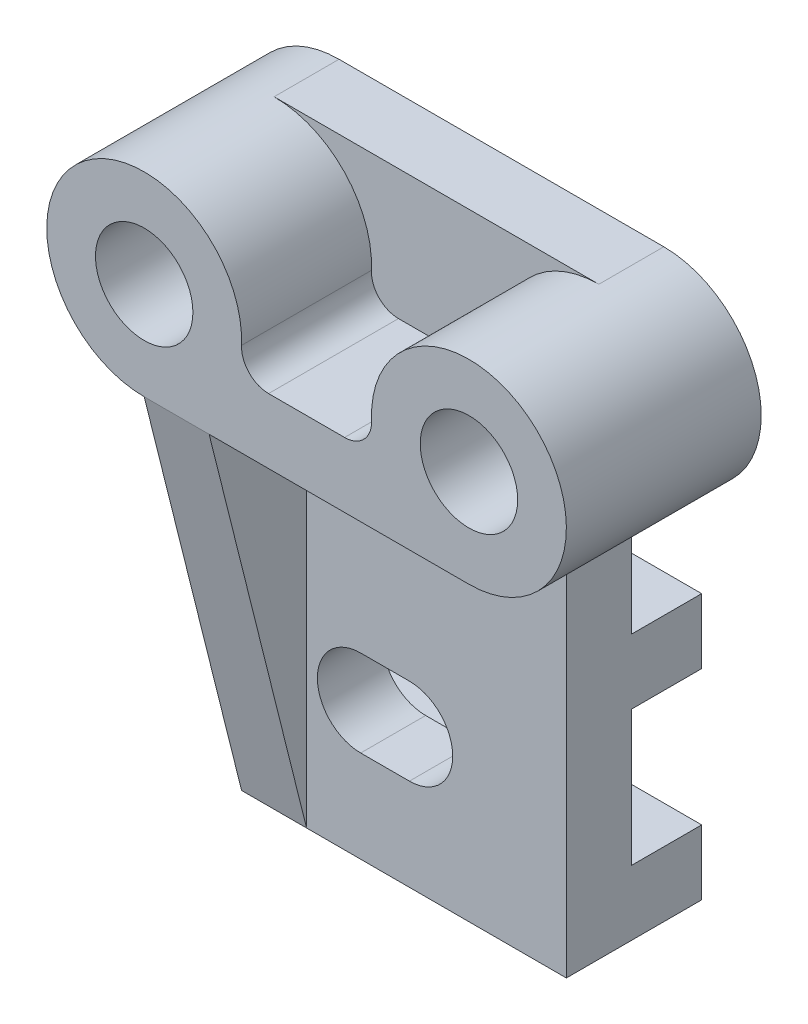
ISO-10303-21;
HEADER;
FILE_DESCRIPTION(('STEP AP214'),'2;1');
FILE_NAME('part.step','',(''),(''),'','','');
FILE_SCHEMA(('AUTOMOTIVE_DESIGN { 1 0 10303 214 1 1 1 1 }'));
ENDSEC;
DATA;
#1=APPLICATION_CONTEXT('core data for automotive mechanical design processes');
#2=APPLICATION_PROTOCOL_DEFINITION('international standard','automotive_design',2000,#1);
#3=PRODUCT_CONTEXT('',#1,'mechanical');
#4=PRODUCT('Part','Part','',(#3));
#5=PRODUCT_RELATED_PRODUCT_CATEGORY('part','',(#4));
#6=PRODUCT_DEFINITION_FORMATION('','',#4);
#7=PRODUCT_DEFINITION_CONTEXT('part definition',#1,'design');
#8=PRODUCT_DEFINITION('design','',#6,#7);
#9=PRODUCT_DEFINITION_SHAPE('','',#8);
#10=(LENGTH_UNIT() NAMED_UNIT(*) SI_UNIT(.MILLI.,.METRE.));
#11=(NAMED_UNIT(*) PLANE_ANGLE_UNIT() SI_UNIT($,.RADIAN.));
#12=(NAMED_UNIT(*) SI_UNIT($,.STERADIAN.) SOLID_ANGLE_UNIT());
#13=UNCERTAINTY_MEASURE_WITH_UNIT(LENGTH_MEASURE(1.E-05),#10,'distance_accuracy_value','');
#14=(GEOMETRIC_REPRESENTATION_CONTEXT(3) GLOBAL_UNCERTAINTY_ASSIGNED_CONTEXT((#13)) GLOBAL_UNIT_ASSIGNED_CONTEXT((#10,
#11,#12)) REPRESENTATION_CONTEXT('',''));
#15=CARTESIAN_POINT('',(0.,0.,0.));
#16=DIRECTION('',(0.,0.,1.));
#17=DIRECTION('',(1.,0.,0.));
#18=AXIS2_PLACEMENT_3D('',#15,#16,#17);
#19=CARTESIAN_POINT('',(0.,0.,6.));
#20=DIRECTION('',(0.,0.,-1.));
#21=DIRECTION('',(-1.,0.,0.));
#22=AXIS2_PLACEMENT_3D('',#19,#20,#21);
#23=PLANE('',#22);
#24=DIRECTION('',(1.,0.,0.));
#25=VECTOR('',#24,1.);
#26=CARTESIAN_POINT('',(0.,-41.,6.));
#27=LINE('',#26,#25);
#28=CARTESIAN_POINT('',(0.,-41.,6.));
#29=VERTEX_POINT('',#28);
#30=CARTESIAN_POINT('',(60.,-41.,6.));
#31=VERTEX_POINT('',#30);
#32=EDGE_CURVE('E63',#29,#31,#27,.T.);
#33=ORIENTED_EDGE('',*,*,#32,.F.);
#34=DIRECTION('',(0.,1.,0.));
#35=VECTOR('',#34,1.);
#36=CARTESIAN_POINT('',(0.,-90.,6.));
#37=LINE('',#36,#35);
#38=CARTESIAN_POINT('',(0.,-18.,6.));
#39=VERTEX_POINT('',#38);
#40=EDGE_CURVE('E250',#29,#39,#37,.T.);
#41=ORIENTED_EDGE('',*,*,#40,.T.);
#42=DIRECTION('',(1.,0.,0.));
#43=VECTOR('',#42,1.);
#44=CARTESIAN_POINT('',(60.,-18.,6.));
#45=LINE('',#44,#43);
#46=CARTESIAN_POINT('',(60.,-18.,6.));
#47=VERTEX_POINT('',#46);
#48=EDGE_CURVE('E249',#39,#47,#45,.T.);
#49=ORIENTED_EDGE('',*,*,#48,.T.);
#50=DIRECTION('',(0.,-1.,0.));
#51=VECTOR('',#50,1.);
#52=CARTESIAN_POINT('',(60.,-18.,6.));
#53=LINE('',#52,#51);
#54=EDGE_CURVE('E59',#47,#31,#53,.T.);
#55=ORIENTED_EDGE('',*,*,#54,.T.);
#56=EDGE_LOOP('',(#33,#41,#49,#55));
#57=FACE_BOUND('',#56,.T.);
#58=ADVANCED_FACE('F43',(#57),#23,.T.);
#59=CARTESIAN_POINT('',(0.,-18.,36.));
#60=DIRECTION('',(0.,1.,0.));
#61=DIRECTION('',(-1.,0.,0.));
#62=AXIS2_PLACEMENT_3D('',#59,#60,#61);
#63=PLANE('',#62);
#64=DIRECTION('',(1.,0.,0.));
#65=VECTOR('',#64,1.);
#66=CARTESIAN_POINT('',(0.,-18.,36.));
#67=LINE('',#66,#65);
#68=CARTESIAN_POINT('',(12.,-18.,36.));
#69=VERTEX_POINT('',#68);
#70=CARTESIAN_POINT('',(60.,-18.,36.));
#71=VERTEX_POINT('',#70);
#72=EDGE_CURVE('E323',#69,#71,#67,.T.);
#73=ORIENTED_EDGE('',*,*,#72,.F.);
#74=DIRECTION('',(0.,0.,-1.));
#75=VECTOR('',#74,1.);
#76=CARTESIAN_POINT('',(12.,-18.,36.));
#77=LINE('',#76,#75);
#78=CARTESIAN_POINT('',(12.,-18.,18.));
#79=VERTEX_POINT('',#78);
#80=EDGE_CURVE('E208',#69,#79,#77,.T.);
#81=ORIENTED_EDGE('',*,*,#80,.T.);
#82=DIRECTION('',(1.,0.,0.));
#83=VECTOR('',#82,1.);
#84=CARTESIAN_POINT('',(60.,-18.,18.));
#85=LINE('',#84,#83);
#86=CARTESIAN_POINT('',(60.,-18.,18.));
#87=VERTEX_POINT('',#86);
#88=EDGE_CURVE('E225',#79,#87,#85,.T.);
#89=ORIENTED_EDGE('',*,*,#88,.T.);
#90=DIRECTION('',(0.,0.,-1.));
#91=VECTOR('',#90,1.);
#92=CARTESIAN_POINT('',(60.,-18.,36.));
#93=LINE('',#92,#91);
#94=EDGE_CURVE('E345',#71,#87,#93,.T.);
#95=ORIENTED_EDGE('',*,*,#94,.F.);
#96=EDGE_LOOP('',(#73,#81,#89,#95));
#97=FACE_BOUND('',#96,.T.);
#98=ADVANCED_FACE('F399',(#97),#63,.F.);
#99=CARTESIAN_POINT('',(37.0217494138479,-0.999999999999998,36.));
#100=DIRECTION('',(0.,0.,-1.));
#101=DIRECTION('',(-1.,0.,0.));
#102=AXIS2_PLACEMENT_3D('',#99,#100,#101);
#103=CYLINDRICAL_SURFACE('',#102,5.);
#104=CARTESIAN_POINT('',(37.0217494138479,-0.999999999999995,12.));
#105=DIRECTION('',(0.,0.,-1.));
#106=DIRECTION('',(1.,0.,0.));
#107=AXIS2_PLACEMENT_3D('',#104,#105,#106);
#108=CIRCLE('',#107,5.);
#109=CARTESIAN_POINT('',(42.0170212804027,-0.78260869565218,12.));
#110=VERTEX_POINT('',#109);
#111=CARTESIAN_POINT('',(37.0217494138479,-6.,12.));
#112=VERTEX_POINT('',#111);
#113=EDGE_CURVE('E265',#110,#112,#108,.T.);
#114=ORIENTED_EDGE('',*,*,#113,.T.);
#115=DIRECTION('',(0.,0.,-1.));
#116=VECTOR('',#115,1.);
#117=CARTESIAN_POINT('',(37.0217494138479,-6.,36.));
#118=LINE('',#117,#116);
#119=CARTESIAN_POINT('',(37.0217494138479,-6.,36.));
#120=VERTEX_POINT('',#119);
#121=EDGE_CURVE('E11',#120,#112,#118,.T.);
#122=ORIENTED_EDGE('',*,*,#121,.F.);
#123=CARTESIAN_POINT('',(37.0217494138479,-0.999999999999998,36.));
#124=DIRECTION('',(0.,0.,-1.));
#125=DIRECTION('',(-1.,0.,0.));
#126=AXIS2_PLACEMENT_3D('',#123,#124,#125);
#127=CIRCLE('',#126,5.);
#128=CARTESIAN_POINT('',(42.0170212804027,-0.78260869565218,36.));
#129=VERTEX_POINT('',#128);
#130=EDGE_CURVE('E308',#129,#120,#127,.T.);
#131=ORIENTED_EDGE('',*,*,#130,.F.);
#132=DIRECTION('',(0.,0.,-1.));
#133=VECTOR('',#132,1.);
#134=CARTESIAN_POINT('',(42.0170212804027,-0.78260869565218,36.));
#135=LINE('',#134,#133);
#136=EDGE_CURVE('E331',#129,#110,#135,.T.);
#137=ORIENTED_EDGE('',*,*,#136,.T.);
#138=EDGE_LOOP('',(#114,#122,#131,#137));
#139=FACE_BOUND('',#138,.T.);
#140=ADVANCED_FACE('F45',(#139),#103,.F.);
#141=CARTESIAN_POINT('',(22.9782505861521,-6.,36.));
#142=DIRECTION('',(0.,-1.,0.));
#143=DIRECTION('',(0.,0.,-1.));
#144=AXIS2_PLACEMENT_3D('',#141,#142,#143);
#145=PLANE('',#144);
#146=DIRECTION('',(-1.,0.,0.));
#147=VECTOR('',#146,1.);
#148=CARTESIAN_POINT('',(37.0217494138479,-6.,12.));
#149=LINE('',#148,#147);
#150=CARTESIAN_POINT('',(22.9782505861521,-6.,12.));
#151=VERTEX_POINT('',#150);
#152=EDGE_CURVE('E268',#112,#151,#149,.T.);
#153=ORIENTED_EDGE('',*,*,#152,.T.);
#154=DIRECTION('',(0.,0.,-1.));
#155=VECTOR('',#154,1.);
#156=CARTESIAN_POINT('',(22.9782505861521,-6.,36.));
#157=LINE('',#156,#155);
#158=CARTESIAN_POINT('',(22.9782505861521,-6.,36.));
#159=VERTEX_POINT('',#158);
#160=EDGE_CURVE('E52',#159,#151,#157,.T.);
#161=ORIENTED_EDGE('',*,*,#160,.F.);
#162=DIRECTION('',(-1.,0.,0.));
#163=VECTOR('',#162,1.);
#164=CARTESIAN_POINT('',(22.9782505861521,-6.,36.));
#165=LINE('',#164,#163);
#166=EDGE_CURVE('E312',#120,#159,#165,.T.);
#167=ORIENTED_EDGE('',*,*,#166,.F.);
#168=ORIENTED_EDGE('',*,*,#121,.T.);
#169=EDGE_LOOP('',(#153,#161,#167,#168));
#170=FACE_BOUND('',#169,.T.);
#171=ADVANCED_FACE('F406',(#170),#145,.F.);
#172=CARTESIAN_POINT('',(22.9782505861521,-0.999999999999999,36.));
#173=DIRECTION('',(0.,0.,-1.));
#174=DIRECTION('',(-1.,0.,0.));
#175=AXIS2_PLACEMENT_3D('',#172,#173,#174);
#176=CYLINDRICAL_SURFACE('',#175,5.);
#177=CARTESIAN_POINT('',(22.9782505861521,-0.999999999999997,12.));
#178=DIRECTION('',(0.,0.,-1.));
#179=DIRECTION('',(-1.,0.,0.));
#180=AXIS2_PLACEMENT_3D('',#177,#178,#179);
#181=CIRCLE('',#180,5.);
#182=CARTESIAN_POINT('',(17.9829787195973,-0.78260869565217,12.));
#183=VERTEX_POINT('',#182);
#184=EDGE_CURVE('E271',#151,#183,#181,.T.);
#185=ORIENTED_EDGE('',*,*,#184,.T.);
#186=DIRECTION('',(0.,0.,-1.));
#187=VECTOR('',#186,1.);
#188=CARTESIAN_POINT('',(17.9829787195973,-0.78260869565217,36.));
#189=LINE('',#188,#187);
#190=CARTESIAN_POINT('',(17.9829787195973,-0.78260869565217,36.));
#191=VERTEX_POINT('',#190);
#192=EDGE_CURVE('E353',#191,#183,#189,.T.);
#193=ORIENTED_EDGE('',*,*,#192,.F.);
#194=CARTESIAN_POINT('',(22.9782505861521,-0.999999999999999,36.));
#195=DIRECTION('',(0.,0.,-1.));
#196=DIRECTION('',(-1.,0.,0.));
#197=AXIS2_PLACEMENT_3D('',#194,#195,#196);
#198=CIRCLE('',#197,5.);
#199=EDGE_CURVE('E316',#159,#191,#198,.T.);
#200=ORIENTED_EDGE('',*,*,#199,.F.);
#201=ORIENTED_EDGE('',*,*,#160,.T.);
#202=EDGE_LOOP('',(#185,#193,#200,#201));
#203=FACE_BOUND('',#202,.T.);
#204=ADVANCED_FACE('F362',(#203),#176,.F.);
#205=CARTESIAN_POINT('',(60.,0.,36.));
#206=DIRECTION('',(0.,0.,-1.));
#207=DIRECTION('',(-1.,0.,0.));
#208=AXIS2_PLACEMENT_3D('',#205,#206,#207);
#209=CYLINDRICAL_SURFACE('',#208,18.);
#210=DIRECTION('',(0.,0.,-1.));
#211=VECTOR('',#210,1.);
#212=CARTESIAN_POINT('',(60.0000000000001,18.,12.));
#213=LINE('',#212,#211);
#214=CARTESIAN_POINT('',(60.0000000000001,18.,12.));
#215=VERTEX_POINT('',#214);
#216=CARTESIAN_POINT('',(60.0000000000001,18.,0.));
#217=VERTEX_POINT('',#216);
#218=EDGE_CURVE('E285',#215,#217,#213,.T.);
#219=ORIENTED_EDGE('',*,*,#218,.F.);
#220=CARTESIAN_POINT('',(60.,0.,12.));
#221=DIRECTION('',(0.,0.,1.));
#222=DIRECTION('',(-1.,0.,0.));
#223=AXIS2_PLACEMENT_3D('',#220,#221,#222);
#224=CIRCLE('',#223,18.);
#225=EDGE_CURVE('E262',#215,#110,#224,.T.);
#226=ORIENTED_EDGE('',*,*,#225,.T.);
#227=ORIENTED_EDGE('',*,*,#136,.F.);
#228=CARTESIAN_POINT('',(60.,0.,36.));
#229=DIRECTION('',(0.,0.,1.));
#230=DIRECTION('',(1.,0.,0.));
#231=AXIS2_PLACEMENT_3D('',#228,#229,#230);
#232=CIRCLE('',#231,18.);
#233=EDGE_CURVE('E328',#71,#129,#232,.T.);
#234=ORIENTED_EDGE('',*,*,#233,.F.);
#235=ORIENTED_EDGE('',*,*,#94,.T.);
#236=DIRECTION('',(0.,0.,-1.));
#237=VECTOR('',#236,1.);
#238=CARTESIAN_POINT('',(60.,-18.,18.));
#239=LINE('',#238,#237);
#240=EDGE_CURVE('E256',#87,#47,#239,.T.);
#241=ORIENTED_EDGE('',*,*,#240,.T.);
#242=CARTESIAN_POINT('',(60.,-18.,0.));
#243=VERTEX_POINT('',#242);
#244=EDGE_CURVE('E344',#47,#243,#93,.T.);
#245=ORIENTED_EDGE('',*,*,#244,.T.);
#246=CARTESIAN_POINT('',(60.,0.,0.));
#247=DIRECTION('',(0.,0.,1.));
#248=DIRECTION('',(1.,0.,0.));
#249=AXIS2_PLACEMENT_3D('',#246,#247,#248);
#250=CIRCLE('',#249,18.);
#251=EDGE_CURVE('E313',#243,#217,#250,.T.);
#252=ORIENTED_EDGE('',*,*,#251,.T.);
#253=EDGE_LOOP('',(#219,#226,#227,#234,#235,#241,#245,#252));
#254=FACE_BOUND('',#253,.T.);
#255=ADVANCED_FACE('F402',(#254),#209,.T.);
#256=CARTESIAN_POINT('',(37.0217494138479,-0.999999999999998,36.));
#257=DIRECTION('',(0.,0.,-1.));
#258=DIRECTION('',(-1.,0.,0.));
#259=AXIS2_PLACEMENT_3D('',#256,#257,#258);
#260=PLANE('',#259);
#261=ORIENTED_EDGE('',*,*,#130,.T.);
#262=ORIENTED_EDGE('',*,*,#166,.T.);
#263=ORIENTED_EDGE('',*,*,#199,.T.);
#264=CARTESIAN_POINT('',(0.,0.,36.));
#265=DIRECTION('',(0.,0.,1.));
#266=DIRECTION('',(1.,0.,0.));
#267=AXIS2_PLACEMENT_3D('',#264,#265,#266);
#268=CIRCLE('',#267,18.);
#269=CARTESIAN_POINT('',(0.,-18.,36.));
#270=VERTEX_POINT('',#269);
#271=EDGE_CURVE('E319',#191,#270,#268,.T.);
#272=ORIENTED_EDGE('',*,*,#271,.T.);
#273=EDGE_CURVE('E324',#270,#69,#67,.T.);
#274=ORIENTED_EDGE('',*,*,#273,.T.);
#275=ORIENTED_EDGE('',*,*,#72,.T.);
#276=ORIENTED_EDGE('',*,*,#233,.T.);
#277=EDGE_LOOP('',(#261,#262,#263,#272,#274,#275,#276));
#278=FACE_BOUND('',#277,.T.);
#279=CARTESIAN_POINT('',(0.,0.,36.));
#280=DIRECTION('',(0.,0.,1.));
#281=DIRECTION('',(1.,0.,0.));
#282=AXIS2_PLACEMENT_3D('',#279,#280,#281);
#283=CIRCLE('',#282,9.);
#284=CARTESIAN_POINT('',(9.,0.,36.));
#285=VERTEX_POINT('',#284);
#286=EDGE_CURVE('E300',#285,#285,#283,.T.);
#287=ORIENTED_EDGE('',*,*,#286,.F.);
#288=EDGE_LOOP('',(#287));
#289=FACE_BOUND('',#288,.T.);
#290=CARTESIAN_POINT('',(60.,0.,36.));
#291=DIRECTION('',(0.,0.,1.));
#292=DIRECTION('',(1.,0.,0.));
#293=AXIS2_PLACEMENT_3D('',#290,#291,#292);
#294=CIRCLE('',#293,9.);
#295=CARTESIAN_POINT('',(69.,0.,36.));
#296=VERTEX_POINT('',#295);
#297=EDGE_CURVE('E292',#296,#296,#294,.T.);
#298=ORIENTED_EDGE('',*,*,#297,.F.);
#299=EDGE_LOOP('',(#298));
#300=FACE_BOUND('',#299,.T.);
#301=ADVANCED_FACE('F394',(#278,#289,#300),#260,.F.);
#302=CARTESIAN_POINT('',(37.0217494138479,-0.999999999999998,0.));
#303=DIRECTION('',(0.,0.,-1.));
#304=DIRECTION('',(-1.,0.,0.));
#305=AXIS2_PLACEMENT_3D('',#302,#303,#304);
#306=PLANE('',#305);
#307=CARTESIAN_POINT('',(0.,0.,0.));
#308=DIRECTION('',(0.,0.,1.));
#309=DIRECTION('',(1.,0.,0.));
#310=AXIS2_PLACEMENT_3D('',#307,#308,#309);
#311=CIRCLE('',#310,18.);
#312=CARTESIAN_POINT('',(0.,18.,0.));
#313=VERTEX_POINT('',#312);
#314=CARTESIAN_POINT('',(0.,-18.,0.));
#315=VERTEX_POINT('',#314);
#316=EDGE_CURVE('E304',#313,#315,#311,.T.);
#317=ORIENTED_EDGE('',*,*,#316,.F.);
#318=DIRECTION('',(1.,0.,0.));
#319=VECTOR('',#318,1.);
#320=CARTESIAN_POINT('',(60.0000000000001,18.,0.));
#321=LINE('',#320,#319);
#322=EDGE_CURVE('E255',#313,#217,#321,.T.);
#323=ORIENTED_EDGE('',*,*,#322,.T.);
#324=ORIENTED_EDGE('',*,*,#251,.F.);
#325=DIRECTION('',(1.,0.,0.));
#326=VECTOR('',#325,1.);
#327=CARTESIAN_POINT('',(0.,-18.,0.));
#328=LINE('',#327,#326);
#329=EDGE_CURVE('E335',#315,#243,#328,.T.);
#330=ORIENTED_EDGE('',*,*,#329,.F.);
#331=EDGE_LOOP('',(#317,#323,#324,#330));
#332=FACE_BOUND('',#331,.T.);
#333=CARTESIAN_POINT('',(0.,0.,0.));
#334=DIRECTION('',(0.,0.,1.));
#335=DIRECTION('',(1.,0.,0.));
#336=AXIS2_PLACEMENT_3D('',#333,#334,#335);
#337=CIRCLE('',#336,9.);
#338=CARTESIAN_POINT('',(9.,0.,0.));
#339=VERTEX_POINT('',#338);
#340=EDGE_CURVE('E296',#339,#339,#337,.T.);
#341=ORIENTED_EDGE('',*,*,#340,.T.);
#342=EDGE_LOOP('',(#341));
#343=FACE_BOUND('',#342,.T.);
#344=CARTESIAN_POINT('',(60.,0.,0.));
#345=DIRECTION('',(0.,0.,1.));
#346=DIRECTION('',(1.,0.,0.));
#347=AXIS2_PLACEMENT_3D('',#344,#345,#346);
#348=CIRCLE('',#347,9.);
#349=CARTESIAN_POINT('',(69.,0.,0.));
#350=VERTEX_POINT('',#349);
#351=EDGE_CURVE('E289',#350,#350,#348,.T.);
#352=ORIENTED_EDGE('',*,*,#351,.T.);
#353=EDGE_LOOP('',(#352));
#354=FACE_BOUND('',#353,.T.);
#355=ADVANCED_FACE('F382',(#332,#343,#354),#306,.T.);
#356=CARTESIAN_POINT('',(0.,0.,36.));
#357=DIRECTION('',(0.,0.,-1.));
#358=DIRECTION('',(-1.,0.,0.));
#359=AXIS2_PLACEMENT_3D('',#356,#357,#358);
#360=CYLINDRICAL_SURFACE('',#359,18.);
#361=CARTESIAN_POINT('',(0.,0.,12.));
#362=DIRECTION('',(0.,0.,1.));
#363=DIRECTION('',(-1.,0.,0.));
#364=AXIS2_PLACEMENT_3D('',#361,#362,#363);
#365=CIRCLE('',#364,18.);
#366=CARTESIAN_POINT('',(0.,18.,12.));
#367=VERTEX_POINT('',#366);
#368=EDGE_CURVE('E274',#183,#367,#365,.T.);
#369=ORIENTED_EDGE('',*,*,#368,.T.);
#370=DIRECTION('',(0.,0.,-1.));
#371=VECTOR('',#370,1.);
#372=CARTESIAN_POINT('',(0.,18.,12.));
#373=LINE('',#372,#371);
#374=EDGE_CURVE('E281',#367,#313,#373,.T.);
#375=ORIENTED_EDGE('',*,*,#374,.T.);
#376=ORIENTED_EDGE('',*,*,#316,.T.);
#377=DIRECTION('',(0.,0.,-1.));
#378=VECTOR('',#377,1.);
#379=CARTESIAN_POINT('',(0.,-18.,36.));
#380=LINE('',#379,#378);
#381=EDGE_CURVE('E349',#39,#315,#380,.T.);
#382=ORIENTED_EDGE('',*,*,#381,.F.);
#383=EDGE_CURVE('E350',#270,#39,#380,.T.);
#384=ORIENTED_EDGE('',*,*,#383,.F.);
#385=ORIENTED_EDGE('',*,*,#271,.F.);
#386=ORIENTED_EDGE('',*,*,#192,.T.);
#387=EDGE_LOOP('',(#369,#375,#376,#382,#384,#385,#386));
#388=FACE_BOUND('',#387,.T.);
#389=ADVANCED_FACE('F374',(#388),#360,.T.);
#390=ORIENTED_EDGE('',*,*,#244,.F.);
#391=ORIENTED_EDGE('',*,*,#48,.F.);
#392=ORIENTED_EDGE('',*,*,#381,.T.);
#393=ORIENTED_EDGE('',*,*,#329,.T.);
#394=EDGE_LOOP('',(#390,#391,#392,#393));
#395=FACE_BOUND('',#394,.T.);
#396=ADVANCED_FACE('F420',(#395),#63,.F.);
#397=CARTESIAN_POINT('',(0.,0.,36.));
#398=DIRECTION('',(0.,0.,-1.));
#399=DIRECTION('',(-1.,0.,0.));
#400=AXIS2_PLACEMENT_3D('',#397,#398,#399);
#401=CYLINDRICAL_SURFACE('',#400,9.);
#402=ORIENTED_EDGE('',*,*,#286,.T.);
#403=EDGE_LOOP('',(#402));
#404=FACE_BOUND('',#403,.T.);
#405=ORIENTED_EDGE('',*,*,#340,.F.);
#406=EDGE_LOOP('',(#405));
#407=FACE_BOUND('',#406,.T.);
#408=ADVANCED_FACE('F828',(#404,#407),#401,.F.);
#409=CARTESIAN_POINT('',(60.,0.,36.));
#410=DIRECTION('',(0.,0.,-1.));
#411=DIRECTION('',(-1.,0.,0.));
#412=AXIS2_PLACEMENT_3D('',#409,#410,#411);
#413=CYLINDRICAL_SURFACE('',#412,9.);
#414=ORIENTED_EDGE('',*,*,#297,.T.);
#415=EDGE_LOOP('',(#414));
#416=FACE_BOUND('',#415,.T.);
#417=ORIENTED_EDGE('',*,*,#351,.F.);
#418=EDGE_LOOP('',(#417));
#419=FACE_BOUND('',#418,.T.);
#420=ADVANCED_FACE('F787',(#416,#419),#413,.F.);
#421=CARTESIAN_POINT('',(60.0000000000001,18.,12.));
#422=DIRECTION('',(0.,1.,0.));
#423=DIRECTION('',(-1.,0.,0.));
#424=AXIS2_PLACEMENT_3D('',#421,#422,#423);
#425=PLANE('',#424);
#426=ORIENTED_EDGE('',*,*,#322,.F.);
#427=ORIENTED_EDGE('',*,*,#374,.F.);
#428=DIRECTION('',(1.,0.,0.));
#429=VECTOR('',#428,1.);
#430=CARTESIAN_POINT('',(60.0000000000001,18.,12.));
#431=LINE('',#430,#429);
#432=EDGE_CURVE('E277',#367,#215,#431,.T.);
#433=ORIENTED_EDGE('',*,*,#432,.T.);
#434=ORIENTED_EDGE('',*,*,#218,.T.);
#435=EDGE_LOOP('',(#426,#427,#433,#434));
#436=FACE_BOUND('',#435,.T.);
#437=ADVANCED_FACE('F379',(#436),#425,.T.);
#438=CARTESIAN_POINT('',(60.,0.,12.));
#439=DIRECTION('',(0.,0.,-1.));
#440=DIRECTION('',(-1.,0.,0.));
#441=AXIS2_PLACEMENT_3D('',#438,#439,#440);
#442=PLANE('',#441);
#443=ORIENTED_EDGE('',*,*,#225,.F.);
#444=ORIENTED_EDGE('',*,*,#432,.F.);
#445=ORIENTED_EDGE('',*,*,#368,.F.);
#446=ORIENTED_EDGE('',*,*,#184,.F.);
#447=ORIENTED_EDGE('',*,*,#152,.F.);
#448=ORIENTED_EDGE('',*,*,#113,.F.);
#449=EDGE_LOOP('',(#443,#444,#445,#446,#447,#448));
#450=FACE_BOUND('',#449,.T.);
#451=ADVANCED_FACE('F369',(#450),#442,.F.);
#452=CARTESIAN_POINT('',(60.,-90.,18.));
#453=DIRECTION('',(0.,-1.,0.));
#454=DIRECTION('',(0.,0.,-1.));
#455=AXIS2_PLACEMENT_3D('',#452,#453,#454);
#456=PLANE('',#455);
#457=DIRECTION('',(0.,0.,-1.));
#458=VECTOR('',#457,1.);
#459=CARTESIAN_POINT('',(0.,-90.,18.));
#460=LINE('',#459,#458);
#461=CARTESIAN_POINT('',(0.,-90.,18.));
#462=VERTEX_POINT('',#461);
#463=CARTESIAN_POINT('',(0.,-90.,-7.));
#464=VERTEX_POINT('',#463);
#465=EDGE_CURVE('E245',#462,#464,#460,.T.);
#466=ORIENTED_EDGE('',*,*,#465,.T.);
#467=DIRECTION('',(1.,0.,0.));
#468=VECTOR('',#467,1.);
#469=CARTESIAN_POINT('',(0.,-90.,-7.));
#470=LINE('',#469,#468);
#471=CARTESIAN_POINT('',(60.,-90.,-7.));
#472=VERTEX_POINT('',#471);
#473=EDGE_CURVE('E496',#464,#472,#470,.T.);
#474=ORIENTED_EDGE('',*,*,#473,.T.);
#475=DIRECTION('',(0.,0.,-1.));
#476=VECTOR('',#475,1.);
#477=CARTESIAN_POINT('',(60.,-90.,18.));
#478=LINE('',#477,#476);
#479=CARTESIAN_POINT('',(60.,-90.,18.));
#480=VERTEX_POINT('',#479);
#481=EDGE_CURVE('E230',#480,#472,#478,.T.);
#482=ORIENTED_EDGE('',*,*,#481,.F.);
#483=DIRECTION('',(-1.,0.,0.));
#484=VECTOR('',#483,1.);
#485=CARTESIAN_POINT('',(60.,-90.,18.));
#486=LINE('',#485,#484);
#487=CARTESIAN_POINT('',(12.,-90.,18.));
#488=VERTEX_POINT('',#487);
#489=EDGE_CURVE('E223',#480,#488,#486,.T.);
#490=ORIENTED_EDGE('',*,*,#489,.T.);
#491=DIRECTION('',(-1.,0.,0.));
#492=VECTOR('',#491,1.);
#493=CARTESIAN_POINT('',(12.,-90.,18.));
#494=LINE('',#493,#492);
#495=EDGE_CURVE('E197',#488,#462,#494,.T.);
#496=ORIENTED_EDGE('',*,*,#495,.T.);
#497=EDGE_LOOP('',(#466,#474,#482,#490,#496));
#498=FACE_BOUND('',#497,.T.);
#499=ADVANCED_FACE('F228',(#498),#456,.T.);
#500=CARTESIAN_POINT('',(60.,-18.,18.));
#501=DIRECTION('',(1.,0.,0.));
#502=DIRECTION('',(0.,1.,0.));
#503=AXIS2_PLACEMENT_3D('',#500,#501,#502);
#504=PLANE('',#503);
#505=ORIENTED_EDGE('',*,*,#54,.F.);
#506=ORIENTED_EDGE('',*,*,#240,.F.);
#507=DIRECTION('',(0.,-1.,0.));
#508=VECTOR('',#507,1.);
#509=CARTESIAN_POINT('',(60.,-18.,18.));
#510=LINE('',#509,#508);
#511=EDGE_CURVE('E235',#87,#480,#510,.T.);
#512=ORIENTED_EDGE('',*,*,#511,.T.);
#513=ORIENTED_EDGE('',*,*,#481,.T.);
#514=DIRECTION('',(0.,1.,0.));
#515=VECTOR('',#514,1.);
#516=CARTESIAN_POINT('',(60.,-90.,-7.));
#517=LINE('',#516,#515);
#518=CARTESIAN_POINT('',(60.,-78.,-7.));
#519=VERTEX_POINT('',#518);
#520=EDGE_CURVE('E507',#472,#519,#517,.T.);
#521=ORIENTED_EDGE('',*,*,#520,.T.);
#522=DIRECTION('',(0.,0.,1.));
#523=VECTOR('',#522,1.);
#524=CARTESIAN_POINT('',(60.,-78.,6.));
#525=LINE('',#524,#523);
#526=CARTESIAN_POINT('',(60.,-78.,6.));
#527=VERTEX_POINT('',#526);
#528=EDGE_CURVE('E502',#519,#527,#525,.T.);
#529=ORIENTED_EDGE('',*,*,#528,.T.);
#530=CARTESIAN_POINT('',(60.,-53.,6.));
#531=VERTEX_POINT('',#530);
#532=EDGE_CURVE('E237',#531,#527,#53,.T.);
#533=ORIENTED_EDGE('',*,*,#532,.F.);
#534=DIRECTION('',(0.,0.,-1.));
#535=VECTOR('',#534,1.);
#536=CARTESIAN_POINT('',(60.,-53.,6.));
#537=LINE('',#536,#535);
#538=CARTESIAN_POINT('',(60.,-53.,-7.));
#539=VERTEX_POINT('',#538);
#540=EDGE_CURVE('E511',#531,#539,#537,.T.);
#541=ORIENTED_EDGE('',*,*,#540,.T.);
#542=DIRECTION('',(0.,1.,0.));
#543=VECTOR('',#542,1.);
#544=CARTESIAN_POINT('',(60.,-53.,-7.));
#545=LINE('',#544,#543);
#546=CARTESIAN_POINT('',(60.,-41.,-7.));
#547=VERTEX_POINT('',#546);
#548=EDGE_CURVE('E534',#539,#547,#545,.T.);
#549=ORIENTED_EDGE('',*,*,#548,.T.);
#550=DIRECTION('',(0.,0.,1.));
#551=VECTOR('',#550,1.);
#552=CARTESIAN_POINT('',(60.,-41.,6.));
#553=LINE('',#552,#551);
#554=EDGE_CURVE('E522',#547,#31,#553,.T.);
#555=ORIENTED_EDGE('',*,*,#554,.T.);
#556=EDGE_LOOP('',(#505,#506,#512,#513,#521,#529,#533,#541,#549,#555));
#557=FACE_BOUND('',#556,.T.);
#558=ADVANCED_FACE('F564',(#557),#504,.T.);
#559=CARTESIAN_POINT('',(0.,-90.,18.));
#560=DIRECTION('',(-1.,0.,0.));
#561=DIRECTION('',(0.,0.,1.));
#562=AXIS2_PLACEMENT_3D('',#559,#560,#561);
#563=PLANE('',#562);
#564=CARTESIAN_POINT('',(0.,-78.,6.));
#565=VERTEX_POINT('',#564);
#566=CARTESIAN_POINT('',(0.,-53.,6.));
#567=VERTEX_POINT('',#566);
#568=EDGE_CURVE('E246',#565,#567,#37,.T.);
#569=ORIENTED_EDGE('',*,*,#568,.F.);
#570=DIRECTION('',(0.,0.,1.));
#571=VECTOR('',#570,1.);
#572=CARTESIAN_POINT('',(0.,-78.,6.));
#573=LINE('',#572,#571);
#574=CARTESIAN_POINT('',(0.,-78.,-7.));
#575=VERTEX_POINT('',#574);
#576=EDGE_CURVE('E499',#575,#565,#573,.T.);
#577=ORIENTED_EDGE('',*,*,#576,.F.);
#578=DIRECTION('',(0.,1.,0.));
#579=VECTOR('',#578,1.);
#580=CARTESIAN_POINT('',(0.,-90.,-7.));
#581=LINE('',#580,#579);
#582=EDGE_CURVE('E506',#464,#575,#581,.T.);
#583=ORIENTED_EDGE('',*,*,#582,.F.);
#584=ORIENTED_EDGE('',*,*,#465,.F.);
#585=DIRECTION('',(0.,0.970142500145332,0.242535625036333));
#586=VECTOR('',#585,1.);
#587=CARTESIAN_POINT('',(0.,-90.,18.));
#588=LINE('',#587,#586);
#589=EDGE_CURVE('E203',#462,#270,#588,.T.);
#590=ORIENTED_EDGE('',*,*,#589,.T.);
#591=ORIENTED_EDGE('',*,*,#383,.T.);
#592=ORIENTED_EDGE('',*,*,#40,.F.);
#593=DIRECTION('',(0.,0.,1.));
#594=VECTOR('',#593,1.);
#595=CARTESIAN_POINT('',(0.,-41.,6.));
#596=LINE('',#595,#594);
#597=CARTESIAN_POINT('',(0.,-41.,-7.));
#598=VERTEX_POINT('',#597);
#599=EDGE_CURVE('E527',#598,#29,#596,.T.);
#600=ORIENTED_EDGE('',*,*,#599,.F.);
#601=DIRECTION('',(0.,1.,0.));
#602=VECTOR('',#601,1.);
#603=CARTESIAN_POINT('',(0.,-53.,-7.));
#604=LINE('',#603,#602);
#605=CARTESIAN_POINT('',(0.,-53.,-7.));
#606=VERTEX_POINT('',#605);
#607=EDGE_CURVE('E523',#606,#598,#604,.T.);
#608=ORIENTED_EDGE('',*,*,#607,.F.);
#609=DIRECTION('',(0.,0.,-1.));
#610=VECTOR('',#609,1.);
#611=CARTESIAN_POINT('',(0.,-53.,6.));
#612=LINE('',#611,#610);
#613=EDGE_CURVE('E518',#567,#606,#612,.T.);
#614=ORIENTED_EDGE('',*,*,#613,.F.);
#615=EDGE_LOOP('',(#569,#577,#583,#584,#590,#591,#592,#600,#608,#614));
#616=FACE_BOUND('',#615,.T.);
#617=ADVANCED_FACE('F433',(#616),#563,.T.);
#618=CARTESIAN_POINT('',(0.,0.,18.));
#619=DIRECTION('',(0.,0.,-1.));
#620=DIRECTION('',(-1.,0.,0.));
#621=AXIS2_PLACEMENT_3D('',#618,#619,#620);
#622=PLANE('',#621);
#623=DIRECTION('',(1.,0.,0.));
#624=VECTOR('',#623,1.);
#625=CARTESIAN_POINT('',(31.,-57.,18.));
#626=LINE('',#625,#624);
#627=CARTESIAN_POINT('',(22.,-57.,18.));
#628=VERTEX_POINT('',#627);
#629=CARTESIAN_POINT('',(31.,-57.,18.));
#630=VERTEX_POINT('',#629);
#631=EDGE_CURVE('E461',#628,#630,#626,.T.);
#632=ORIENTED_EDGE('',*,*,#631,.T.);
#633=CARTESIAN_POINT('',(31.,-65.,18.));
#634=DIRECTION('',(0.,0.,-1.));
#635=DIRECTION('',(-1.,0.,0.));
#636=AXIS2_PLACEMENT_3D('',#633,#634,#635);
#637=CIRCLE('',#636,8.);
#638=CARTESIAN_POINT('',(31.,-73.,18.));
#639=VERTEX_POINT('',#638);
#640=EDGE_CURVE('E469',#630,#639,#637,.T.);
#641=ORIENTED_EDGE('',*,*,#640,.T.);
#642=DIRECTION('',(-1.,0.,0.));
#643=VECTOR('',#642,1.);
#644=CARTESIAN_POINT('',(31.,-73.,18.));
#645=LINE('',#644,#643);
#646=CARTESIAN_POINT('',(22.,-73.,18.));
#647=VERTEX_POINT('',#646);
#648=EDGE_CURVE('E489',#639,#647,#645,.T.);
#649=ORIENTED_EDGE('',*,*,#648,.T.);
#650=CARTESIAN_POINT('',(22.,-65.,18.));
#651=DIRECTION('',(0.,0.,-1.));
#652=DIRECTION('',(-1.,0.,0.));
#653=AXIS2_PLACEMENT_3D('',#650,#651,#652);
#654=CIRCLE('',#653,8.00000000000001);
#655=EDGE_CURVE('E484',#647,#628,#654,.T.);
#656=ORIENTED_EDGE('',*,*,#655,.T.);
#657=EDGE_LOOP('',(#632,#641,#649,#656));
#658=FACE_BOUND('',#657,.T.);
#659=ORIENTED_EDGE('',*,*,#88,.F.);
#660=DIRECTION('',(0.,-1.,0.));
#661=VECTOR('',#660,1.);
#662=CARTESIAN_POINT('',(12.,-18.,18.));
#663=LINE('',#662,#661);
#664=EDGE_CURVE('E213',#79,#488,#663,.T.);
#665=ORIENTED_EDGE('',*,*,#664,.T.);
#666=ORIENTED_EDGE('',*,*,#489,.F.);
#667=ORIENTED_EDGE('',*,*,#511,.F.);
#668=EDGE_LOOP('',(#659,#665,#666,#667));
#669=FACE_BOUND('',#668,.T.);
#670=ADVANCED_FACE('F221',(#658,#669),#622,.F.);
#671=DIRECTION('',(1.,0.,0.));
#672=VECTOR('',#671,1.);
#673=CARTESIAN_POINT('',(0.,-53.,6.));
#674=LINE('',#673,#672);
#675=EDGE_CURVE('E438',#567,#531,#674,.T.);
#676=ORIENTED_EDGE('',*,*,#675,.T.);
#677=ORIENTED_EDGE('',*,*,#532,.T.);
#678=DIRECTION('',(1.,0.,0.));
#679=VECTOR('',#678,1.);
#680=CARTESIAN_POINT('',(0.,-78.,6.));
#681=LINE('',#680,#679);
#682=EDGE_CURVE('E451',#565,#527,#681,.T.);
#683=ORIENTED_EDGE('',*,*,#682,.F.);
#684=ORIENTED_EDGE('',*,*,#568,.T.);
#685=EDGE_LOOP('',(#676,#677,#683,#684));
#686=FACE_BOUND('',#685,.T.);
#687=CARTESIAN_POINT('',(31.,-65.,6.));
#688=DIRECTION('',(0.,0.,-1.));
#689=DIRECTION('',(-1.,0.,0.));
#690=AXIS2_PLACEMENT_3D('',#687,#688,#689);
#691=CIRCLE('',#690,8.);
#692=CARTESIAN_POINT('',(31.,-57.,6.));
#693=VERTEX_POINT('',#692);
#694=CARTESIAN_POINT('',(31.,-73.,6.));
#695=VERTEX_POINT('',#694);
#696=EDGE_CURVE('E443',#693,#695,#691,.T.);
#697=ORIENTED_EDGE('',*,*,#696,.F.);
#698=DIRECTION('',(1.,0.,0.));
#699=VECTOR('',#698,1.);
#700=CARTESIAN_POINT('',(31.,-57.,6.));
#701=LINE('',#700,#699);
#702=CARTESIAN_POINT('',(22.,-57.,6.));
#703=VERTEX_POINT('',#702);
#704=EDGE_CURVE('E446',#703,#693,#701,.T.);
#705=ORIENTED_EDGE('',*,*,#704,.F.);
#706=CARTESIAN_POINT('',(22.,-65.,6.));
#707=DIRECTION('',(0.,0.,-1.));
#708=DIRECTION('',(-1.,0.,0.));
#709=AXIS2_PLACEMENT_3D('',#706,#707,#708);
#710=CIRCLE('',#709,8.00000000000001);
#711=CARTESIAN_POINT('',(22.,-73.,6.));
#712=VERTEX_POINT('',#711);
#713=EDGE_CURVE('E455',#712,#703,#710,.T.);
#714=ORIENTED_EDGE('',*,*,#713,.F.);
#715=DIRECTION('',(-1.,0.,0.));
#716=VECTOR('',#715,1.);
#717=CARTESIAN_POINT('',(31.,-73.,6.));
#718=LINE('',#717,#716);
#719=EDGE_CURVE('E448',#695,#712,#718,.T.);
#720=ORIENTED_EDGE('',*,*,#719,.F.);
#721=EDGE_LOOP('',(#697,#705,#714,#720));
#722=FACE_BOUND('',#721,.T.);
#723=ADVANCED_FACE('F415',(#686,#722),#23,.T.);
#724=CARTESIAN_POINT('',(31.,-65.,18.));
#725=DIRECTION('',(0.,0.,-1.));
#726=DIRECTION('',(-1.,0.,0.));
#727=AXIS2_PLACEMENT_3D('',#724,#725,#726);
#728=CYLINDRICAL_SURFACE('',#727,8.);
#729=ORIENTED_EDGE('',*,*,#696,.T.);
#730=DIRECTION('',(0.,0.,-1.));
#731=VECTOR('',#730,1.);
#732=CARTESIAN_POINT('',(31.,-73.,18.));
#733=LINE('',#732,#731);
#734=EDGE_CURVE('E240',#639,#695,#733,.T.);
#735=ORIENTED_EDGE('',*,*,#734,.F.);
#736=ORIENTED_EDGE('',*,*,#640,.F.);
#737=DIRECTION('',(0.,0.,-1.));
#738=VECTOR('',#737,1.);
#739=CARTESIAN_POINT('',(31.,-57.,18.));
#740=LINE('',#739,#738);
#741=EDGE_CURVE('E470',#630,#693,#740,.T.);
#742=ORIENTED_EDGE('',*,*,#741,.T.);
#743=EDGE_LOOP('',(#729,#735,#736,#742));
#744=FACE_BOUND('',#743,.T.);
#745=ADVANCED_FACE('F424',(#744),#728,.F.);
#746=CARTESIAN_POINT('',(31.,-57.,18.));
#747=DIRECTION('',(0.,1.,0.));
#748=DIRECTION('',(-1.,0.,0.));
#749=AXIS2_PLACEMENT_3D('',#746,#747,#748);
#750=PLANE('',#749);
#751=ORIENTED_EDGE('',*,*,#704,.T.);
#752=ORIENTED_EDGE('',*,*,#741,.F.);
#753=ORIENTED_EDGE('',*,*,#631,.F.);
#754=DIRECTION('',(0.,0.,-1.));
#755=VECTOR('',#754,1.);
#756=CARTESIAN_POINT('',(22.,-57.,18.));
#757=LINE('',#756,#755);
#758=EDGE_CURVE('E473',#628,#703,#757,.T.);
#759=ORIENTED_EDGE('',*,*,#758,.T.);
#760=EDGE_LOOP('',(#751,#752,#753,#759));
#761=FACE_BOUND('',#760,.T.);
#762=ADVANCED_FACE('F430',(#761),#750,.F.);
#763=CARTESIAN_POINT('',(22.,-65.,18.));
#764=DIRECTION('',(0.,0.,-1.));
#765=DIRECTION('',(-1.,0.,0.));
#766=AXIS2_PLACEMENT_3D('',#763,#764,#765);
#767=CYLINDRICAL_SURFACE('',#766,8.00000000000001);
#768=ORIENTED_EDGE('',*,*,#713,.T.);
#769=ORIENTED_EDGE('',*,*,#758,.F.);
#770=ORIENTED_EDGE('',*,*,#655,.F.);
#771=DIRECTION('',(0.,0.,-1.));
#772=VECTOR('',#771,1.);
#773=CARTESIAN_POINT('',(22.,-73.,18.));
#774=LINE('',#773,#772);
#775=EDGE_CURVE('E475',#647,#712,#774,.T.);
#776=ORIENTED_EDGE('',*,*,#775,.T.);
#777=EDGE_LOOP('',(#768,#769,#770,#776));
#778=FACE_BOUND('',#777,.T.);
#779=ADVANCED_FACE('F598',(#778),#767,.F.);
#780=CARTESIAN_POINT('',(31.,-73.,18.));
#781=DIRECTION('',(0.,-1.,0.));
#782=DIRECTION('',(0.,0.,-1.));
#783=AXIS2_PLACEMENT_3D('',#780,#781,#782);
#784=PLANE('',#783);
#785=ORIENTED_EDGE('',*,*,#719,.T.);
#786=ORIENTED_EDGE('',*,*,#775,.F.);
#787=ORIENTED_EDGE('',*,*,#648,.F.);
#788=ORIENTED_EDGE('',*,*,#734,.T.);
#789=EDGE_LOOP('',(#785,#786,#787,#788));
#790=FACE_BOUND('',#789,.T.);
#791=ADVANCED_FACE('F593',(#790),#784,.F.);
#792=CARTESIAN_POINT('',(0.,-78.,6.));
#793=DIRECTION('',(0.,1.,0.));
#794=DIRECTION('',(-1.,0.,0.));
#795=AXIS2_PLACEMENT_3D('',#792,#793,#794);
#796=PLANE('',#795);
#797=ORIENTED_EDGE('',*,*,#528,.F.);
#798=DIRECTION('',(1.,0.,0.));
#799=VECTOR('',#798,1.);
#800=CARTESIAN_POINT('',(0.,-78.,-7.));
#801=LINE('',#800,#799);
#802=EDGE_CURVE('E458',#575,#519,#801,.T.);
#803=ORIENTED_EDGE('',*,*,#802,.F.);
#804=ORIENTED_EDGE('',*,*,#576,.T.);
#805=ORIENTED_EDGE('',*,*,#682,.T.);
#806=EDGE_LOOP('',(#797,#803,#804,#805));
#807=FACE_BOUND('',#806,.T.);
#808=ADVANCED_FACE('F566',(#807),#796,.T.);
#809=CARTESIAN_POINT('',(0.,-90.,-7.));
#810=DIRECTION('',(0.,0.,-1.));
#811=DIRECTION('',(-1.,0.,0.));
#812=AXIS2_PLACEMENT_3D('',#809,#810,#811);
#813=PLANE('',#812);
#814=ORIENTED_EDGE('',*,*,#520,.F.);
#815=ORIENTED_EDGE('',*,*,#473,.F.);
#816=ORIENTED_EDGE('',*,*,#582,.T.);
#817=ORIENTED_EDGE('',*,*,#802,.T.);
#818=EDGE_LOOP('',(#814,#815,#816,#817));
#819=FACE_BOUND('',#818,.T.);
#820=ADVANCED_FACE('F561',(#819),#813,.T.);
#821=CARTESIAN_POINT('',(0.,-41.,6.));
#822=DIRECTION('',(0.,1.,0.));
#823=DIRECTION('',(-1.,0.,0.));
#824=AXIS2_PLACEMENT_3D('',#821,#822,#823);
#825=PLANE('',#824);
#826=ORIENTED_EDGE('',*,*,#554,.F.);
#827=DIRECTION('',(1.,0.,0.));
#828=VECTOR('',#827,1.);
#829=CARTESIAN_POINT('',(0.,-41.,-7.));
#830=LINE('',#829,#828);
#831=EDGE_CURVE('E543',#598,#547,#830,.T.);
#832=ORIENTED_EDGE('',*,*,#831,.F.);
#833=ORIENTED_EDGE('',*,*,#599,.T.);
#834=ORIENTED_EDGE('',*,*,#32,.T.);
#835=EDGE_LOOP('',(#826,#832,#833,#834));
#836=FACE_BOUND('',#835,.T.);
#837=ADVANCED_FACE('F578',(#836),#825,.T.);
#838=CARTESIAN_POINT('',(0.,-53.,-7.));
#839=DIRECTION('',(0.,0.,-1.));
#840=DIRECTION('',(-1.,0.,0.));
#841=AXIS2_PLACEMENT_3D('',#838,#839,#840);
#842=PLANE('',#841);
#843=ORIENTED_EDGE('',*,*,#548,.F.);
#844=DIRECTION('',(1.,0.,0.));
#845=VECTOR('',#844,1.);
#846=CARTESIAN_POINT('',(0.,-53.,-7.));
#847=LINE('',#846,#845);
#848=EDGE_CURVE('E546',#606,#539,#847,.T.);
#849=ORIENTED_EDGE('',*,*,#848,.F.);
#850=ORIENTED_EDGE('',*,*,#607,.T.);
#851=ORIENTED_EDGE('',*,*,#831,.T.);
#852=EDGE_LOOP('',(#843,#849,#850,#851));
#853=FACE_BOUND('',#852,.T.);
#854=ADVANCED_FACE('F580',(#853),#842,.T.);
#855=CARTESIAN_POINT('',(0.,-53.,6.));
#856=DIRECTION('',(0.,-1.,0.));
#857=DIRECTION('',(1.,0.,0.));
#858=AXIS2_PLACEMENT_3D('',#855,#856,#857);
#859=PLANE('',#858);
#860=ORIENTED_EDGE('',*,*,#540,.F.);
#861=ORIENTED_EDGE('',*,*,#675,.F.);
#862=ORIENTED_EDGE('',*,*,#613,.T.);
#863=ORIENTED_EDGE('',*,*,#848,.T.);
#864=EDGE_LOOP('',(#860,#861,#862,#863));
#865=FACE_BOUND('',#864,.T.);
#866=ADVANCED_FACE('F571',(#865),#859,.T.);
#867=CARTESIAN_POINT('',(12.,-90.,18.));
#868=DIRECTION('',(0.,-0.242535625036333,0.970142500145332));
#869=DIRECTION('',(0.,-0.970142500145332,-0.242535625036333));
#870=AXIS2_PLACEMENT_3D('',#867,#868,#869);
#871=PLANE('',#870);
#872=ORIENTED_EDGE('',*,*,#589,.F.);
#873=ORIENTED_EDGE('',*,*,#495,.F.);
#874=DIRECTION('',(0.,0.970142500145332,0.242535625036333));
#875=VECTOR('',#874,1.);
#876=CARTESIAN_POINT('',(12.,-90.,18.));
#877=LINE('',#876,#875);
#878=EDGE_CURVE('E200',#488,#69,#877,.T.);
#879=ORIENTED_EDGE('',*,*,#878,.T.);
#880=ORIENTED_EDGE('',*,*,#273,.F.);
#881=EDGE_LOOP('',(#872,#873,#879,#880));
#882=FACE_BOUND('',#881,.T.);
#883=ADVANCED_FACE('F199',(#882),#871,.T.);
#884=CARTESIAN_POINT('',(12.,0.,0.));
#885=DIRECTION('',(1.,0.,0.));
#886=DIRECTION('',(0.,0.,-1.));
#887=AXIS2_PLACEMENT_3D('',#884,#885,#886);
#888=PLANE('',#887);
#889=ORIENTED_EDGE('',*,*,#664,.F.);
#890=ORIENTED_EDGE('',*,*,#80,.F.);
#891=ORIENTED_EDGE('',*,*,#878,.F.);
#892=EDGE_LOOP('',(#889,#890,#891));
#893=FACE_BOUND('',#892,.T.);
#894=ADVANCED_FACE('F212',(#893),#888,.T.);
#895=CLOSED_SHELL('',(#58,#98,#140,#171,#204,#255,#301,#355,#389,#396,#408,#420,#437,#451,#499,
#558,#617,#670,#723,#745,#762,#779,#791,#808,#820,#837,#854,#866,#883,#894));
#896=MANIFOLD_SOLID_BREP('B2',#895);
#897=ADVANCED_BREP_SHAPE_REPRESENTATION('',(#18,#896),#14);
#898=SHAPE_DEFINITION_REPRESENTATION(#9,#897);
ENDSEC;
END-ISO-10303-21;
